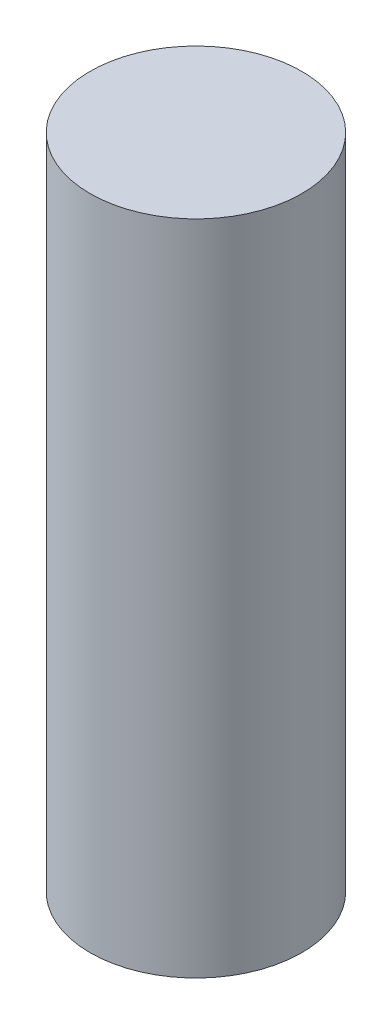
ISO-10303-21;
HEADER;
FILE_DESCRIPTION(('STEP AP214'),'2;1');
FILE_NAME('part.step','',(''),(''),'','','');
FILE_SCHEMA(('AUTOMOTIVE_DESIGN { 1 0 10303 214 1 1 1 1 }'));
ENDSEC;
DATA;
#1=APPLICATION_CONTEXT('core data for automotive mechanical design processes');
#2=APPLICATION_PROTOCOL_DEFINITION('international standard','automotive_design',2000,#1);
#3=PRODUCT_CONTEXT('',#1,'mechanical');
#4=PRODUCT('Part','Part','',(#3));
#5=PRODUCT_RELATED_PRODUCT_CATEGORY('part','',(#4));
#6=PRODUCT_DEFINITION_FORMATION('','',#4);
#7=PRODUCT_DEFINITION_CONTEXT('part definition',#1,'design');
#8=PRODUCT_DEFINITION('design','',#6,#7);
#9=PRODUCT_DEFINITION_SHAPE('','',#8);
#10=(LENGTH_UNIT() NAMED_UNIT(*) SI_UNIT(.MILLI.,.METRE.));
#11=(NAMED_UNIT(*) PLANE_ANGLE_UNIT() SI_UNIT($,.RADIAN.));
#12=(NAMED_UNIT(*) SI_UNIT($,.STERADIAN.) SOLID_ANGLE_UNIT());
#13=UNCERTAINTY_MEASURE_WITH_UNIT(LENGTH_MEASURE(1.E-05),#10,'distance_accuracy_value','');
#14=(GEOMETRIC_REPRESENTATION_CONTEXT(3) GLOBAL_UNCERTAINTY_ASSIGNED_CONTEXT((#13)) GLOBAL_UNIT_ASSIGNED_CONTEXT((#10,
#11,#12)) REPRESENTATION_CONTEXT('',''));
#15=CARTESIAN_POINT('',(0.,0.,0.));
#16=DIRECTION('',(0.,0.,1.));
#17=DIRECTION('',(1.,0.,0.));
#18=AXIS2_PLACEMENT_3D('',#15,#16,#17);
#19=CARTESIAN_POINT('',(0.,74.5,0.));
#20=DIRECTION('',(0.,-1.,0.));
#21=DIRECTION('',(0.,0.,-1.));
#22=AXIS2_PLACEMENT_3D('',#19,#20,#21);
#23=CYLINDRICAL_SURFACE('',#22,12.);
#24=CARTESIAN_POINT('',(0.,74.5,0.));
#25=DIRECTION('',(0.,1.,0.));
#26=DIRECTION('',(0.,0.,1.));
#27=AXIS2_PLACEMENT_3D('',#24,#25,#26);
#28=CIRCLE('',#27,12.);
#29=CARTESIAN_POINT('',(0.,74.5,12.));
#30=VERTEX_POINT('',#29);
#31=EDGE_CURVE('E12',#30,#30,#28,.T.);
#32=ORIENTED_EDGE('',*,*,#31,.F.);
#33=EDGE_LOOP('',(#32));
#34=FACE_BOUND('',#33,.T.);
#35=CARTESIAN_POINT('',(0.,0.,0.));
#36=DIRECTION('',(0.,1.,0.));
#37=DIRECTION('',(0.,0.,1.));
#38=AXIS2_PLACEMENT_3D('',#35,#36,#37);
#39=CIRCLE('',#38,12.);
#40=CARTESIAN_POINT('',(0.,0.,12.));
#41=VERTEX_POINT('',#40);
#42=EDGE_CURVE('E45',#41,#41,#39,.T.);
#43=ORIENTED_EDGE('',*,*,#42,.T.);
#44=EDGE_LOOP('',(#43));
#45=FACE_BOUND('',#44,.T.);
#46=ADVANCED_FACE('F42',(#34,#45),#23,.T.);
#47=CARTESIAN_POINT('',(0.,74.5,0.));
#48=DIRECTION('',(0.,1.,0.));
#49=DIRECTION('',(0.,0.,1.));
#50=AXIS2_PLACEMENT_3D('',#47,#48,#49);
#51=PLANE('',#50);
#52=ORIENTED_EDGE('',*,*,#31,.T.);
#53=EDGE_LOOP('',(#52));
#54=FACE_BOUND('',#53,.T.);
#55=ADVANCED_FACE('F57',(#54),#51,.T.);
#56=CARTESIAN_POINT('',(0.,0.,0.));
#57=DIRECTION('',(0.,1.,0.));
#58=DIRECTION('',(0.,0.,1.));
#59=AXIS2_PLACEMENT_3D('',#56,#57,#58);
#60=PLANE('',#59);
#61=ORIENTED_EDGE('',*,*,#42,.F.);
#62=EDGE_LOOP('',(#61));
#63=FACE_BOUND('',#62,.T.);
#64=ADVANCED_FACE('F55',(#63),#60,.F.);
#65=CLOSED_SHELL('',(#46,#55,#64));
#66=MANIFOLD_SOLID_BREP('B2',#65);
#67=ADVANCED_BREP_SHAPE_REPRESENTATION('',(#18,#66),#14);
#68=SHAPE_DEFINITION_REPRESENTATION(#9,#67);
ENDSEC;
END-ISO-10303-21;
